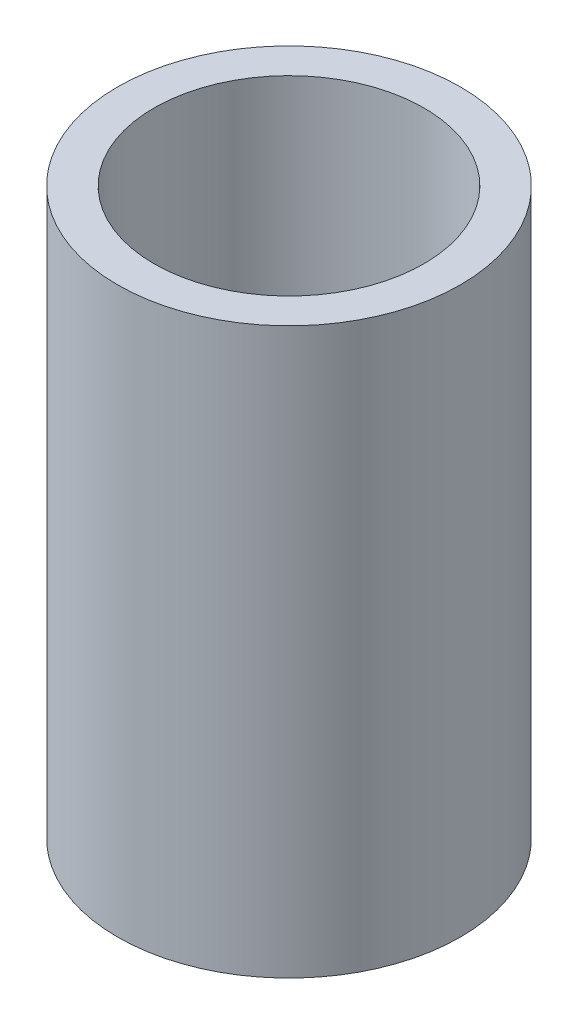
ISO-10303-21;
HEADER;
FILE_DESCRIPTION(('STEP AP214'),'2;1');
FILE_NAME('part.step','',(''),(''),'','','');
FILE_SCHEMA(('AUTOMOTIVE_DESIGN { 1 0 10303 214 1 1 1 1 }'));
ENDSEC;
DATA;
#1=APPLICATION_CONTEXT('core data for automotive mechanical design processes');
#2=APPLICATION_PROTOCOL_DEFINITION('international standard','automotive_design',2000,#1);
#3=PRODUCT_CONTEXT('',#1,'mechanical');
#4=PRODUCT('Part','Part','',(#3));
#5=PRODUCT_RELATED_PRODUCT_CATEGORY('part','',(#4));
#6=PRODUCT_DEFINITION_FORMATION('','',#4);
#7=PRODUCT_DEFINITION_CONTEXT('part definition',#1,'design');
#8=PRODUCT_DEFINITION('design','',#6,#7);
#9=PRODUCT_DEFINITION_SHAPE('','',#8);
#10=(LENGTH_UNIT() NAMED_UNIT(*) SI_UNIT(.MILLI.,.METRE.));
#11=(NAMED_UNIT(*) PLANE_ANGLE_UNIT() SI_UNIT($,.RADIAN.));
#12=(NAMED_UNIT(*) SI_UNIT($,.STERADIAN.) SOLID_ANGLE_UNIT());
#13=UNCERTAINTY_MEASURE_WITH_UNIT(LENGTH_MEASURE(1.E-05),#10,'distance_accuracy_value','');
#14=(GEOMETRIC_REPRESENTATION_CONTEXT(3) GLOBAL_UNCERTAINTY_ASSIGNED_CONTEXT((#13)) GLOBAL_UNIT_ASSIGNED_CONTEXT((#10,
#11,#12)) REPRESENTATION_CONTEXT('',''));
#15=CARTESIAN_POINT('',(0.,0.,0.));
#16=DIRECTION('',(0.,0.,1.));
#17=DIRECTION('',(1.,0.,0.));
#18=AXIS2_PLACEMENT_3D('',#15,#16,#17);
#19=CARTESIAN_POINT('',(0.,-8.37,0.));
#20=DIRECTION('',(0.,1.,0.));
#21=DIRECTION('',(0.,0.,1.));
#22=AXIS2_PLACEMENT_3D('',#19,#20,#21);
#23=CYLINDRICAL_SURFACE('',#22,2.54);
#24=CARTESIAN_POINT('',(0.,-8.37,0.));
#25=DIRECTION('',(0.,1.,0.));
#26=DIRECTION('',(0.,0.,1.));
#27=AXIS2_PLACEMENT_3D('',#24,#25,#26);
#28=CIRCLE('',#27,2.54);
#29=CARTESIAN_POINT('',(0.,-8.37,2.54));
#30=VERTEX_POINT('',#29);
#31=EDGE_CURVE('E10',#30,#30,#28,.T.);
#32=ORIENTED_EDGE('',*,*,#31,.T.);
#33=EDGE_LOOP('',(#32));
#34=FACE_BOUND('',#33,.T.);
#35=CARTESIAN_POINT('',(0.,0.,0.));
#36=DIRECTION('',(0.,1.,0.));
#37=DIRECTION('',(0.,0.,1.));
#38=AXIS2_PLACEMENT_3D('',#35,#36,#37);
#39=CIRCLE('',#38,2.54);
#40=CARTESIAN_POINT('',(0.,0.,2.54));
#41=VERTEX_POINT('',#40);
#42=EDGE_CURVE('E40',#41,#41,#39,.T.);
#43=ORIENTED_EDGE('',*,*,#42,.F.);
#44=EDGE_LOOP('',(#43));
#45=FACE_BOUND('',#44,.T.);
#46=ADVANCED_FACE('F37',(#34,#45),#23,.T.);
#47=CARTESIAN_POINT('',(0.,-8.37,0.));
#48=DIRECTION('',(0.,1.,0.));
#49=DIRECTION('',(0.,0.,1.));
#50=AXIS2_PLACEMENT_3D('',#47,#48,#49);
#51=PLANE('',#50);
#52=CARTESIAN_POINT('',(0.,-8.37,0.));
#53=DIRECTION('',(0.,1.,0.));
#54=DIRECTION('',(0.,0.,1.));
#55=AXIS2_PLACEMENT_3D('',#52,#53,#54);
#56=CIRCLE('',#55,2.);
#57=CARTESIAN_POINT('',(0.,-8.37,2.));
#58=VERTEX_POINT('',#57);
#59=EDGE_CURVE('E49',#58,#58,#56,.T.);
#60=ORIENTED_EDGE('',*,*,#59,.T.);
#61=EDGE_LOOP('',(#60));
#62=FACE_BOUND('',#61,.T.);
#63=ORIENTED_EDGE('',*,*,#31,.F.);
#64=EDGE_LOOP('',(#63));
#65=FACE_BOUND('',#64,.T.);
#66=ADVANCED_FACE('F59',(#62,#65),#51,.F.);
#67=CARTESIAN_POINT('',(0.,0.,0.));
#68=DIRECTION('',(0.,1.,0.));
#69=DIRECTION('',(0.,0.,1.));
#70=AXIS2_PLACEMENT_3D('',#67,#68,#69);
#71=PLANE('',#70);
#72=CARTESIAN_POINT('',(0.,0.,0.));
#73=DIRECTION('',(0.,1.,0.));
#74=DIRECTION('',(0.,0.,1.));
#75=AXIS2_PLACEMENT_3D('',#72,#73,#74);
#76=CIRCLE('',#75,2.);
#77=CARTESIAN_POINT('',(0.,0.,2.));
#78=VERTEX_POINT('',#77);
#79=EDGE_CURVE('E51',#78,#78,#76,.T.);
#80=ORIENTED_EDGE('',*,*,#79,.F.);
#81=EDGE_LOOP('',(#80));
#82=FACE_BOUND('',#81,.T.);
#83=ORIENTED_EDGE('',*,*,#42,.T.);
#84=EDGE_LOOP('',(#83));
#85=FACE_BOUND('',#84,.T.);
#86=ADVANCED_FACE('F65',(#82,#85),#71,.T.);
#87=CARTESIAN_POINT('',(0.,-8.37,0.));
#88=DIRECTION('',(0.,1.,0.));
#89=DIRECTION('',(0.,0.,1.));
#90=AXIS2_PLACEMENT_3D('',#87,#88,#89);
#91=CYLINDRICAL_SURFACE('',#90,2.);
#92=ORIENTED_EDGE('',*,*,#59,.F.);
#93=EDGE_LOOP('',(#92));
#94=FACE_BOUND('',#93,.T.);
#95=ORIENTED_EDGE('',*,*,#79,.T.);
#96=EDGE_LOOP('',(#95));
#97=FACE_BOUND('',#96,.T.);
#98=ADVANCED_FACE('F62',(#94,#97),#91,.F.);
#99=CLOSED_SHELL('',(#46,#66,#86,#98));
#100=MANIFOLD_SOLID_BREP('B2',#99);
#101=ADVANCED_BREP_SHAPE_REPRESENTATION('',(#18,#100),#14);
#102=SHAPE_DEFINITION_REPRESENTATION(#9,#101);
ENDSEC;
END-ISO-10303-21;
